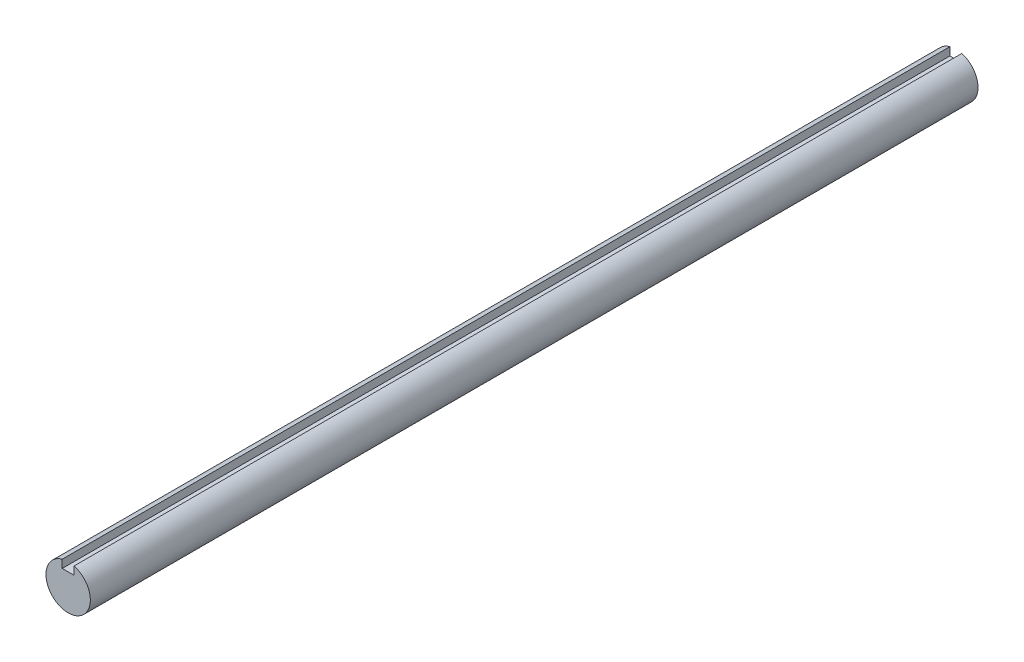
ISO-10303-21;
HEADER;
FILE_DESCRIPTION(('STEP AP214'),'2;1');
FILE_NAME('part.step','',(''),(''),'','','');
FILE_SCHEMA(('AUTOMOTIVE_DESIGN { 1 0 10303 214 1 1 1 1 }'));
ENDSEC;
DATA;
#1=APPLICATION_CONTEXT('core data for automotive mechanical design processes');
#2=APPLICATION_PROTOCOL_DEFINITION('international standard','automotive_design',2000,#1);
#3=PRODUCT_CONTEXT('',#1,'mechanical');
#4=PRODUCT('Part','Part','',(#3));
#5=PRODUCT_RELATED_PRODUCT_CATEGORY('part','',(#4));
#6=PRODUCT_DEFINITION_FORMATION('','',#4);
#7=PRODUCT_DEFINITION_CONTEXT('part definition',#1,'design');
#8=PRODUCT_DEFINITION('design','',#6,#7);
#9=PRODUCT_DEFINITION_SHAPE('','',#8);
#10=(LENGTH_UNIT() NAMED_UNIT(*) SI_UNIT(.MILLI.,.METRE.));
#11=(NAMED_UNIT(*) PLANE_ANGLE_UNIT() SI_UNIT($,.RADIAN.));
#12=(NAMED_UNIT(*) SI_UNIT($,.STERADIAN.) SOLID_ANGLE_UNIT());
#13=UNCERTAINTY_MEASURE_WITH_UNIT(LENGTH_MEASURE(1.E-05),#10,'distance_accuracy_value','');
#14=(GEOMETRIC_REPRESENTATION_CONTEXT(3) GLOBAL_UNCERTAINTY_ASSIGNED_CONTEXT((#13)) GLOBAL_UNIT_ASSIGNED_CONTEXT((#10,
#11,#12)) REPRESENTATION_CONTEXT('',''));
#15=CARTESIAN_POINT('',(0.,0.,0.));
#16=DIRECTION('',(0.,0.,1.));
#17=DIRECTION('',(1.,0.,0.));
#18=AXIS2_PLACEMENT_3D('',#15,#16,#17);
#19=CARTESIAN_POINT('',(0.,0.,30.));
#20=DIRECTION('',(0.,0.,-1.));
#21=DIRECTION('',(-1.,0.,0.));
#22=AXIS2_PLACEMENT_3D('',#19,#20,#21);
#23=CYLINDRICAL_SURFACE('',#22,0.75);
#24=DIRECTION('',(0.,0.,-1.));
#25=VECTOR('',#24,1.);
#26=CARTESIAN_POINT('',(-0.2,0.722841614740048,30.));
#27=LINE('',#26,#25);
#28=CARTESIAN_POINT('',(-0.2,0.722841614740048,0.));
#29=VERTEX_POINT('',#28);
#30=CARTESIAN_POINT('',(-0.2,0.722841614740048,30.));
#31=VERTEX_POINT('',#30);
#32=EDGE_CURVE('E98',#29,#31,#27,.F.);
#33=ORIENTED_EDGE('',*,*,#32,.F.);
#34=CARTESIAN_POINT('',(0.,0.,0.));
#35=DIRECTION('',(0.,0.,1.));
#36=DIRECTION('',(1.,0.,0.));
#37=AXIS2_PLACEMENT_3D('',#34,#35,#36);
#38=CIRCLE('',#37,0.75);
#39=CARTESIAN_POINT('',(0.2,0.722841614740048,0.));
#40=VERTEX_POINT('',#39);
#41=EDGE_CURVE('E45',#29,#40,#38,.T.);
#42=ORIENTED_EDGE('',*,*,#41,.T.);
#43=DIRECTION('',(0.,0.,-1.));
#44=VECTOR('',#43,1.);
#45=CARTESIAN_POINT('',(0.2,0.722841614740048,30.));
#46=LINE('',#45,#44);
#47=CARTESIAN_POINT('',(0.2,0.722841614740048,30.));
#48=VERTEX_POINT('',#47);
#49=EDGE_CURVE('E111',#40,#48,#46,.F.);
#50=ORIENTED_EDGE('',*,*,#49,.T.);
#51=CARTESIAN_POINT('',(0.,0.,30.));
#52=DIRECTION('',(0.,0.,1.));
#53=DIRECTION('',(1.,0.,0.));
#54=AXIS2_PLACEMENT_3D('',#51,#52,#53);
#55=CIRCLE('',#54,0.75);
#56=EDGE_CURVE('E11',#31,#48,#55,.T.);
#57=ORIENTED_EDGE('',*,*,#56,.F.);
#58=EDGE_LOOP('',(#33,#42,#50,#57));
#59=FACE_BOUND('',#58,.T.);
#60=ADVANCED_FACE('F42',(#59),#23,.T.);
#61=CARTESIAN_POINT('',(0.,0.,30.));
#62=DIRECTION('',(0.,0.,1.));
#63=DIRECTION('',(1.,0.,0.));
#64=AXIS2_PLACEMENT_3D('',#61,#62,#63);
#65=PLANE('',#64);
#66=DIRECTION('',(1.,0.,0.));
#67=VECTOR('',#66,1.);
#68=CARTESIAN_POINT('',(0.,0.45,30.));
#69=LINE('',#68,#67);
#70=CARTESIAN_POINT('',(-0.2,0.45,30.));
#71=VERTEX_POINT('',#70);
#72=CARTESIAN_POINT('',(0.2,0.45,30.));
#73=VERTEX_POINT('',#72);
#74=EDGE_CURVE('E104',#71,#73,#69,.T.);
#75=ORIENTED_EDGE('',*,*,#74,.F.);
#76=DIRECTION('',(0.,1.,0.));
#77=VECTOR('',#76,1.);
#78=CARTESIAN_POINT('',(-0.2,0.45,30.));
#79=LINE('',#78,#77);
#80=EDGE_CURVE('E97',#71,#31,#79,.T.);
#81=ORIENTED_EDGE('',*,*,#80,.T.);
#82=ORIENTED_EDGE('',*,*,#56,.T.);
#83=DIRECTION('',(0.,1.,0.));
#84=VECTOR('',#83,1.);
#85=CARTESIAN_POINT('',(0.2,0.45,30.));
#86=LINE('',#85,#84);
#87=EDGE_CURVE('E91',#73,#48,#86,.T.);
#88=ORIENTED_EDGE('',*,*,#87,.F.);
#89=EDGE_LOOP('',(#75,#81,#82,#88));
#90=FACE_BOUND('',#89,.T.);
#91=ADVANCED_FACE('F116',(#90),#65,.T.);
#92=CARTESIAN_POINT('',(0.,0.,0.));
#93=DIRECTION('',(0.,0.,1.));
#94=DIRECTION('',(1.,0.,0.));
#95=AXIS2_PLACEMENT_3D('',#92,#93,#94);
#96=PLANE('',#95);
#97=DIRECTION('',(0.,1.,0.));
#98=VECTOR('',#97,1.);
#99=CARTESIAN_POINT('',(-0.2,0.45,0.));
#100=LINE('',#99,#98);
#101=CARTESIAN_POINT('',(-0.2,0.45,0.));
#102=VERTEX_POINT('',#101);
#103=EDGE_CURVE('E95',#102,#29,#100,.T.);
#104=ORIENTED_EDGE('',*,*,#103,.F.);
#105=DIRECTION('',(1.,0.,0.));
#106=VECTOR('',#105,1.);
#107=CARTESIAN_POINT('',(0.,0.45,0.));
#108=LINE('',#107,#106);
#109=CARTESIAN_POINT('',(0.2,0.45,0.));
#110=VERTEX_POINT('',#109);
#111=EDGE_CURVE('E82',#102,#110,#108,.T.);
#112=ORIENTED_EDGE('',*,*,#111,.T.);
#113=DIRECTION('',(0.,1.,0.));
#114=VECTOR('',#113,1.);
#115=CARTESIAN_POINT('',(0.2,0.45,0.));
#116=LINE('',#115,#114);
#117=EDGE_CURVE('E56',#110,#40,#116,.T.);
#118=ORIENTED_EDGE('',*,*,#117,.T.);
#119=ORIENTED_EDGE('',*,*,#41,.F.);
#120=EDGE_LOOP('',(#104,#112,#118,#119));
#121=FACE_BOUND('',#120,.T.);
#122=ADVANCED_FACE('F100',(#121),#96,.F.);
#123=CARTESIAN_POINT('',(0.2,0.45,0.));
#124=DIRECTION('',(1.,0.,0.));
#125=DIRECTION('',(0.,0.,-1.));
#126=AXIS2_PLACEMENT_3D('',#123,#124,#125);
#127=PLANE('',#126);
#128=ORIENTED_EDGE('',*,*,#117,.F.);
#129=DIRECTION('',(0.,0.,1.));
#130=VECTOR('',#129,1.);
#131=CARTESIAN_POINT('',(0.2,0.45,0.));
#132=LINE('',#131,#130);
#133=EDGE_CURVE('E88',#110,#73,#132,.T.);
#134=ORIENTED_EDGE('',*,*,#133,.T.);
#135=ORIENTED_EDGE('',*,*,#87,.T.);
#136=ORIENTED_EDGE('',*,*,#49,.F.);
#137=EDGE_LOOP('',(#128,#134,#135,#136));
#138=FACE_BOUND('',#137,.T.);
#139=ADVANCED_FACE('F113',(#138),#127,.F.);
#140=CARTESIAN_POINT('',(0.,0.45,0.));
#141=DIRECTION('',(0.,-1.,0.));
#142=DIRECTION('',(0.,0.,-1.));
#143=AXIS2_PLACEMENT_3D('',#140,#141,#142);
#144=PLANE('',#143);
#145=ORIENTED_EDGE('',*,*,#74,.T.);
#146=ORIENTED_EDGE('',*,*,#133,.F.);
#147=ORIENTED_EDGE('',*,*,#111,.F.);
#148=DIRECTION('',(0.,0.,1.));
#149=VECTOR('',#148,1.);
#150=CARTESIAN_POINT('',(-0.2,0.45,0.));
#151=LINE('',#150,#149);
#152=EDGE_CURVE('E86',#102,#71,#151,.T.);
#153=ORIENTED_EDGE('',*,*,#152,.T.);
#154=EDGE_LOOP('',(#145,#146,#147,#153));
#155=FACE_BOUND('',#154,.T.);
#156=ADVANCED_FACE('F85',(#155),#144,.F.);
#157=CARTESIAN_POINT('',(-0.2,0.45,0.));
#158=DIRECTION('',(1.,0.,0.));
#159=DIRECTION('',(0.,0.,-1.));
#160=AXIS2_PLACEMENT_3D('',#157,#158,#159);
#161=PLANE('',#160);
#162=ORIENTED_EDGE('',*,*,#32,.T.);
#163=ORIENTED_EDGE('',*,*,#80,.F.);
#164=ORIENTED_EDGE('',*,*,#152,.F.);
#165=ORIENTED_EDGE('',*,*,#103,.T.);
#166=EDGE_LOOP('',(#162,#163,#164,#165));
#167=FACE_BOUND('',#166,.T.);
#168=ADVANCED_FACE('F94',(#167),#161,.T.);
#169=CLOSED_SHELL('',(#60,#91,#122,#139,#156,#168));
#170=MANIFOLD_SOLID_BREP('B2',#169);
#171=ADVANCED_BREP_SHAPE_REPRESENTATION('',(#18,#170),#14);
#172=SHAPE_DEFINITION_REPRESENTATION(#9,#171);
ENDSEC;
END-ISO-10303-21;
